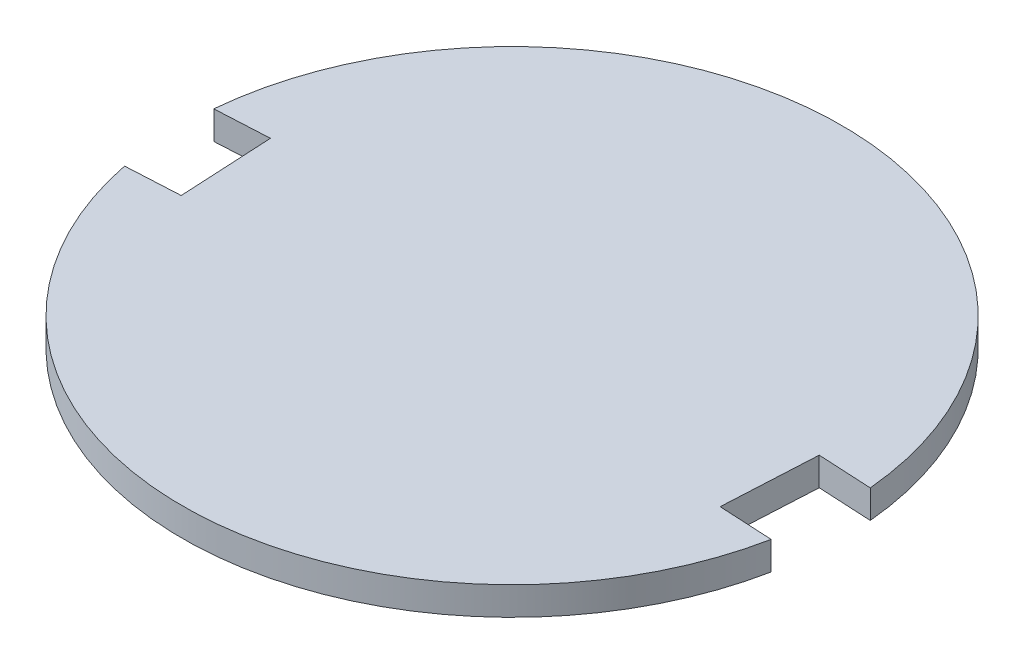
ISO-10303-21;
HEADER;
FILE_DESCRIPTION(('STEP AP214'),'2;1');
FILE_NAME('part.step','',(''),(''),'','','');
FILE_SCHEMA(('AUTOMOTIVE_DESIGN { 1 0 10303 214 1 1 1 1 }'));
ENDSEC;
DATA;
#1=APPLICATION_CONTEXT('core data for automotive mechanical design processes');
#2=APPLICATION_PROTOCOL_DEFINITION('international standard','automotive_design',2000,#1);
#3=PRODUCT_CONTEXT('',#1,'mechanical');
#4=PRODUCT('Part','Part','',(#3));
#5=PRODUCT_RELATED_PRODUCT_CATEGORY('part','',(#4));
#6=PRODUCT_DEFINITION_FORMATION('','',#4);
#7=PRODUCT_DEFINITION_CONTEXT('part definition',#1,'design');
#8=PRODUCT_DEFINITION('design','',#6,#7);
#9=PRODUCT_DEFINITION_SHAPE('','',#8);
#10=(LENGTH_UNIT() NAMED_UNIT(*) SI_UNIT(.MILLI.,.METRE.));
#11=(NAMED_UNIT(*) PLANE_ANGLE_UNIT() SI_UNIT($,.RADIAN.));
#12=(NAMED_UNIT(*) SI_UNIT($,.STERADIAN.) SOLID_ANGLE_UNIT());
#13=UNCERTAINTY_MEASURE_WITH_UNIT(LENGTH_MEASURE(1.E-05),#10,'distance_accuracy_value','');
#14=(GEOMETRIC_REPRESENTATION_CONTEXT(3) GLOBAL_UNCERTAINTY_ASSIGNED_CONTEXT((#13)) GLOBAL_UNIT_ASSIGNED_CONTEXT((#10,
#11,#12)) REPRESENTATION_CONTEXT('',''));
#15=CARTESIAN_POINT('',(0.,0.,0.));
#16=DIRECTION('',(0.,0.,1.));
#17=DIRECTION('',(1.,0.,0.));
#18=AXIS2_PLACEMENT_3D('',#15,#16,#17);
#19=CARTESIAN_POINT('',(2.27013722600386,3.,-17.1395360563293));
#20=DIRECTION('',(0.,-1.,0.));
#21=DIRECTION('',(0.,0.,-1.));
#22=AXIS2_PLACEMENT_3D('',#19,#20,#21);
#23=CYLINDRICAL_SURFACE('',#22,35.);
#24=CARTESIAN_POINT('',(2.27013722600386,0.,-17.1395360563293));
#25=DIRECTION('',(0.,1.,0.));
#26=DIRECTION('',(0.,0.,1.));
#27=AXIS2_PLACEMENT_3D('',#24,#25,#26);
#28=CIRCLE('',#27,35.);
#29=CARTESIAN_POINT('',(-32.0590257375146,0.,-10.3198168374615));
#30=VERTEX_POINT('',#29);
#31=CARTESIAN_POINT('',(36.5993001895223,0.,-10.3198168374615));
#32=VERTEX_POINT('',#31);
#33=EDGE_CURVE('E137',#30,#32,#28,.T.);
#34=ORIENTED_EDGE('',*,*,#33,.T.);
#35=DIRECTION('',(0.,-1.,0.));
#36=VECTOR('',#35,1.);
#37=CARTESIAN_POINT('',(36.5993001895223,3.,-10.3198168374615));
#38=LINE('',#37,#36);
#39=CARTESIAN_POINT('',(36.5993001895223,3.,-10.3198168374615));
#40=VERTEX_POINT('',#39);
#41=EDGE_CURVE('E11',#40,#32,#38,.T.);
#42=ORIENTED_EDGE('',*,*,#41,.F.);
#43=CARTESIAN_POINT('',(2.27013722600386,3.,-17.1395360563293));
#44=DIRECTION('',(0.,1.,0.));
#45=DIRECTION('',(0.,0.,1.));
#46=AXIS2_PLACEMENT_3D('',#43,#44,#45);
#47=CIRCLE('',#46,35.);
#48=CARTESIAN_POINT('',(-32.0590257375146,3.,-10.3198168374615));
#49=VERTEX_POINT('',#48);
#50=EDGE_CURVE('E151',#49,#40,#47,.T.);
#51=ORIENTED_EDGE('',*,*,#50,.F.);
#52=DIRECTION('',(0.,-1.,0.));
#53=VECTOR('',#52,1.);
#54=CARTESIAN_POINT('',(-32.0590257375146,3.,-10.3198168374615));
#55=LINE('',#54,#53);
#56=EDGE_CURVE('E133',#49,#30,#55,.T.);
#57=ORIENTED_EDGE('',*,*,#56,.T.);
#58=EDGE_LOOP('',(#34,#42,#51,#57));
#59=FACE_BOUND('',#58,.T.);
#60=ADVANCED_FACE('F41',(#59),#23,.T.);
#61=CARTESIAN_POINT('',(36.5993001895223,3.,-10.3198168374615));
#62=DIRECTION('',(-0.0523359562429439,0.,0.998629534754574));
#63=DIRECTION('',(0.998629534754574,0.,0.0523359562429439));
#64=AXIS2_PLACEMENT_3D('',#61,#62,#63);
#65=PLANE('',#64);
#66=DIRECTION('',(-0.998629534754574,0.,-0.0523359562429439));
#67=VECTOR('',#66,1.);
#68=CARTESIAN_POINT('',(36.5993001895223,0.,-10.3198168374615));
#69=LINE('',#68,#67);
#70=CARTESIAN_POINT('',(30.8848177542112,0.,-10.6193001716481));
#71=VERTEX_POINT('',#70);
#72=EDGE_CURVE('E140',#32,#71,#69,.T.);
#73=ORIENTED_EDGE('',*,*,#72,.T.);
#74=DIRECTION('',(0.,-1.,0.));
#75=VECTOR('',#74,1.);
#76=CARTESIAN_POINT('',(30.8848177542112,3.,-10.6193001716481));
#77=LINE('',#76,#75);
#78=CARTESIAN_POINT('',(30.8848177542112,3.,-10.6193001716481));
#79=VERTEX_POINT('',#78);
#80=EDGE_CURVE('E49',#79,#71,#77,.T.);
#81=ORIENTED_EDGE('',*,*,#80,.F.);
#82=DIRECTION('',(-0.998629534754574,0.,-0.0523359562429439));
#83=VECTOR('',#82,1.);
#84=CARTESIAN_POINT('',(36.5993001895223,3.,-10.3198168374615));
#85=LINE('',#84,#83);
#86=EDGE_CURVE('E100',#40,#79,#85,.T.);
#87=ORIENTED_EDGE('',*,*,#86,.F.);
#88=ORIENTED_EDGE('',*,*,#41,.T.);
#89=EDGE_LOOP('',(#73,#81,#87,#88));
#90=FACE_BOUND('',#89,.T.);
#91=ADVANCED_FACE('F186',(#90),#65,.F.);
#92=CARTESIAN_POINT('',(30.8848177542112,3.,-10.6193001716481));
#93=DIRECTION('',(-0.998629534754574,0.,-0.052335956242944));
#94=DIRECTION('',(-0.052335956242944,0.,0.998629534754574));
#95=AXIS2_PLACEMENT_3D('',#92,#93,#94);
#96=PLANE('',#95);
#97=DIRECTION('',(0.052335956242944,0.,-0.998629534754574));
#98=VECTOR('',#97,1.);
#99=CARTESIAN_POINT('',(30.8848177542112,0.,-10.6193001716481));
#100=LINE('',#99,#98);
#101=CARTESIAN_POINT('',(31.4088955470416,0.,-20.6193001716481));
#102=VERTEX_POINT('',#101);
#103=EDGE_CURVE('E142',#71,#102,#100,.T.);
#104=ORIENTED_EDGE('',*,*,#103,.T.);
#105=DIRECTION('',(0.,-1.,0.));
#106=VECTOR('',#105,1.);
#107=CARTESIAN_POINT('',(31.4088955470416,3.,-20.6193001716481));
#108=LINE('',#107,#106);
#109=CARTESIAN_POINT('',(31.4088955470416,3.,-20.6193001716481));
#110=VERTEX_POINT('',#109);
#111=EDGE_CURVE('E158',#110,#102,#108,.T.);
#112=ORIENTED_EDGE('',*,*,#111,.F.);
#113=DIRECTION('',(0.052335956242944,0.,-0.998629534754574));
#114=VECTOR('',#113,1.);
#115=CARTESIAN_POINT('',(30.8848177542112,3.,-10.6193001716481));
#116=LINE('',#115,#114);
#117=EDGE_CURVE('E166',#79,#110,#116,.T.);
#118=ORIENTED_EDGE('',*,*,#117,.F.);
#119=ORIENTED_EDGE('',*,*,#80,.T.);
#120=EDGE_LOOP('',(#104,#112,#118,#119));
#121=FACE_BOUND('',#120,.T.);
#122=ADVANCED_FACE('F164',(#121),#96,.F.);
#123=CARTESIAN_POINT('',(31.4088955470416,3.,-20.6193001716481));
#124=DIRECTION('',(0.0523359562429448,0.,-0.998629534754574));
#125=DIRECTION('',(-0.998629534754574,0.,-0.0523359562429448));
#126=AXIS2_PLACEMENT_3D('',#123,#124,#125);
#127=PLANE('',#126);
#128=DIRECTION('',(0.998629534754574,0.,0.0523359562429448));
#129=VECTOR('',#128,1.);
#130=CARTESIAN_POINT('',(31.4088955470416,0.,-20.6193001716481));
#131=LINE('',#130,#129);
#132=CARTESIAN_POINT('',(37.1253588498944,0.,-20.3197130245926));
#133=VERTEX_POINT('',#132);
#134=EDGE_CURVE('E144',#102,#133,#131,.T.);
#135=ORIENTED_EDGE('',*,*,#134,.T.);
#136=DIRECTION('',(0.,-1.,0.));
#137=VECTOR('',#136,1.);
#138=CARTESIAN_POINT('',(37.1253588498944,3.,-20.3197130245926));
#139=LINE('',#138,#137);
#140=CARTESIAN_POINT('',(37.1253588498944,3.,-20.3197130245926));
#141=VERTEX_POINT('',#140);
#142=EDGE_CURVE('E155',#141,#133,#139,.T.);
#143=ORIENTED_EDGE('',*,*,#142,.F.);
#144=DIRECTION('',(0.998629534754574,0.,0.0523359562429448));
#145=VECTOR('',#144,1.);
#146=CARTESIAN_POINT('',(31.4088955470416,3.,-20.6193001716481));
#147=LINE('',#146,#145);
#148=EDGE_CURVE('E178',#110,#141,#147,.T.);
#149=ORIENTED_EDGE('',*,*,#148,.F.);
#150=ORIENTED_EDGE('',*,*,#111,.T.);
#151=EDGE_LOOP('',(#135,#143,#149,#150));
#152=FACE_BOUND('',#151,.T.);
#153=ADVANCED_FACE('F174',(#152),#127,.F.);
#154=CARTESIAN_POINT('',(2.27013722600386,3.,-17.1395360563293));
#155=DIRECTION('',(0.,-1.,0.));
#156=DIRECTION('',(0.,0.,-1.));
#157=AXIS2_PLACEMENT_3D('',#154,#155,#156);
#158=CYLINDRICAL_SURFACE('',#157,35.);
#159=CARTESIAN_POINT('',(2.27013722600386,0.,-17.1395360563293));
#160=DIRECTION('',(0.,1.,0.));
#161=DIRECTION('',(0.,0.,1.));
#162=AXIS2_PLACEMENT_3D('',#159,#160,#161);
#163=CIRCLE('',#162,35.);
#164=CARTESIAN_POINT('',(-32.5850843978867,0.,-20.3197130245926));
#165=VERTEX_POINT('',#164);
#166=EDGE_CURVE('E146',#133,#165,#163,.T.);
#167=ORIENTED_EDGE('',*,*,#166,.T.);
#168=DIRECTION('',(0.,-1.,0.));
#169=VECTOR('',#168,1.);
#170=CARTESIAN_POINT('',(-32.5850843978867,3.,-20.3197130245926));
#171=LINE('',#170,#169);
#172=CARTESIAN_POINT('',(-32.5850843978867,3.,-20.3197130245926));
#173=VERTEX_POINT('',#172);
#174=EDGE_CURVE('E128',#173,#165,#171,.T.);
#175=ORIENTED_EDGE('',*,*,#174,.F.);
#176=CARTESIAN_POINT('',(2.27013722600386,3.,-17.1395360563293));
#177=DIRECTION('',(0.,1.,0.));
#178=DIRECTION('',(0.,0.,1.));
#179=AXIS2_PLACEMENT_3D('',#176,#177,#178);
#180=CIRCLE('',#179,35.);
#181=EDGE_CURVE('E119',#141,#173,#180,.T.);
#182=ORIENTED_EDGE('',*,*,#181,.F.);
#183=ORIENTED_EDGE('',*,*,#142,.T.);
#184=EDGE_LOOP('',(#167,#175,#182,#183));
#185=FACE_BOUND('',#184,.T.);
#186=ADVANCED_FACE('F177',(#185),#158,.T.);
#187=CARTESIAN_POINT('',(-26.8686210950339,3.,-20.6193001716481));
#188=DIRECTION('',(-0.0523359562429448,0.,-0.998629534754574));
#189=DIRECTION('',(-0.998629534754574,0.,0.0523359562429448));
#190=AXIS2_PLACEMENT_3D('',#187,#188,#189);
#191=PLANE('',#190);
#192=DIRECTION('',(0.998629534754574,0.,-0.0523359562429448));
#193=VECTOR('',#192,1.);
#194=CARTESIAN_POINT('',(-26.8686210950339,0.,-20.6193001716481));
#195=LINE('',#194,#193);
#196=CARTESIAN_POINT('',(-26.8686210950339,0.,-20.6193001716481));
#197=VERTEX_POINT('',#196);
#198=EDGE_CURVE('E127',#165,#197,#195,.T.);
#199=ORIENTED_EDGE('',*,*,#198,.T.);
#200=DIRECTION('',(0.,-1.,0.));
#201=VECTOR('',#200,1.);
#202=CARTESIAN_POINT('',(-26.8686210950339,3.,-20.6193001716481));
#203=LINE('',#202,#201);
#204=CARTESIAN_POINT('',(-26.8686210950339,3.,-20.6193001716481));
#205=VERTEX_POINT('',#204);
#206=EDGE_CURVE('E124',#205,#197,#203,.T.);
#207=ORIENTED_EDGE('',*,*,#206,.F.);
#208=DIRECTION('',(0.998629534754574,0.,-0.0523359562429448));
#209=VECTOR('',#208,1.);
#210=CARTESIAN_POINT('',(-26.8686210950339,3.,-20.6193001716481));
#211=LINE('',#210,#209);
#212=EDGE_CURVE('E113',#173,#205,#211,.T.);
#213=ORIENTED_EDGE('',*,*,#212,.F.);
#214=ORIENTED_EDGE('',*,*,#174,.T.);
#215=EDGE_LOOP('',(#199,#207,#213,#214));
#216=FACE_BOUND('',#215,.T.);
#217=ADVANCED_FACE('F125',(#216),#191,.F.);
#218=CARTESIAN_POINT('',(-26.3445433022035,3.,-10.6193001716481));
#219=DIRECTION('',(0.998629534754574,0.,-0.052335956242944));
#220=DIRECTION('',(-0.052335956242944,0.,-0.998629534754574));
#221=AXIS2_PLACEMENT_3D('',#218,#219,#220);
#222=PLANE('',#221);
#223=DIRECTION('',(0.052335956242944,0.,0.998629534754574));
#224=VECTOR('',#223,1.);
#225=CARTESIAN_POINT('',(-26.3445433022035,0.,-10.6193001716481));
#226=LINE('',#225,#224);
#227=CARTESIAN_POINT('',(-26.3445433022035,0.,-10.6193001716481));
#228=VERTEX_POINT('',#227);
#229=EDGE_CURVE('E86',#197,#228,#226,.T.);
#230=ORIENTED_EDGE('',*,*,#229,.T.);
#231=DIRECTION('',(0.,-1.,0.));
#232=VECTOR('',#231,1.);
#233=CARTESIAN_POINT('',(-26.3445433022035,3.,-10.6193001716481));
#234=LINE('',#233,#232);
#235=CARTESIAN_POINT('',(-26.3445433022035,3.,-10.6193001716481));
#236=VERTEX_POINT('',#235);
#237=EDGE_CURVE('E129',#236,#228,#234,.T.);
#238=ORIENTED_EDGE('',*,*,#237,.F.);
#239=DIRECTION('',(0.052335956242944,0.,0.998629534754574));
#240=VECTOR('',#239,1.);
#241=CARTESIAN_POINT('',(-26.3445433022035,3.,-10.6193001716481));
#242=LINE('',#241,#240);
#243=EDGE_CURVE('E117',#205,#236,#242,.T.);
#244=ORIENTED_EDGE('',*,*,#243,.F.);
#245=ORIENTED_EDGE('',*,*,#206,.T.);
#246=EDGE_LOOP('',(#230,#238,#244,#245));
#247=FACE_BOUND('',#246,.T.);
#248=ADVANCED_FACE('F131',(#247),#222,.F.);
#249=CARTESIAN_POINT('',(-32.0590257375146,3.,-10.3198168374615));
#250=DIRECTION('',(0.0523359562429439,0.,0.998629534754574));
#251=DIRECTION('',(0.998629534754574,0.,-0.0523359562429439));
#252=AXIS2_PLACEMENT_3D('',#249,#250,#251);
#253=PLANE('',#252);
#254=DIRECTION('',(-0.998629534754574,0.,0.0523359562429439));
#255=VECTOR('',#254,1.);
#256=CARTESIAN_POINT('',(-32.0590257375146,0.,-10.3198168374615));
#257=LINE('',#256,#255);
#258=EDGE_CURVE('E92',#228,#30,#257,.T.);
#259=ORIENTED_EDGE('',*,*,#258,.T.);
#260=ORIENTED_EDGE('',*,*,#56,.F.);
#261=DIRECTION('',(-0.998629534754574,0.,0.0523359562429439));
#262=VECTOR('',#261,1.);
#263=CARTESIAN_POINT('',(-32.0590257375146,3.,-10.3198168374615));
#264=LINE('',#263,#262);
#265=EDGE_CURVE('E57',#236,#49,#264,.T.);
#266=ORIENTED_EDGE('',*,*,#265,.F.);
#267=ORIENTED_EDGE('',*,*,#237,.T.);
#268=EDGE_LOOP('',(#259,#260,#266,#267));
#269=FACE_BOUND('',#268,.T.);
#270=ADVANCED_FACE('F202',(#269),#253,.F.);
#271=CARTESIAN_POINT('',(2.27013722600386,3.,-17.1395360563293));
#272=DIRECTION('',(0.,1.,0.));
#273=DIRECTION('',(0.,0.,1.));
#274=AXIS2_PLACEMENT_3D('',#271,#272,#273);
#275=PLANE('',#274);
#276=ORIENTED_EDGE('',*,*,#50,.T.);
#277=ORIENTED_EDGE('',*,*,#86,.T.);
#278=ORIENTED_EDGE('',*,*,#117,.T.);
#279=ORIENTED_EDGE('',*,*,#148,.T.);
#280=ORIENTED_EDGE('',*,*,#181,.T.);
#281=ORIENTED_EDGE('',*,*,#212,.T.);
#282=ORIENTED_EDGE('',*,*,#243,.T.);
#283=ORIENTED_EDGE('',*,*,#265,.T.);
#284=EDGE_LOOP('',(#276,#277,#278,#279,#280,#281,#282,#283));
#285=FACE_BOUND('',#284,.T.);
#286=ADVANCED_FACE('F115',(#285),#275,.T.);
#287=CARTESIAN_POINT('',(2.27013722600386,0.,-17.1395360563293));
#288=DIRECTION('',(0.,1.,0.));
#289=DIRECTION('',(0.,0.,1.));
#290=AXIS2_PLACEMENT_3D('',#287,#288,#289);
#291=PLANE('',#290);
#292=ORIENTED_EDGE('',*,*,#33,.F.);
#293=ORIENTED_EDGE('',*,*,#258,.F.);
#294=ORIENTED_EDGE('',*,*,#229,.F.);
#295=ORIENTED_EDGE('',*,*,#198,.F.);
#296=ORIENTED_EDGE('',*,*,#166,.F.);
#297=ORIENTED_EDGE('',*,*,#134,.F.);
#298=ORIENTED_EDGE('',*,*,#103,.F.);
#299=ORIENTED_EDGE('',*,*,#72,.F.);
#300=EDGE_LOOP('',(#292,#293,#294,#295,#296,#297,#298,#299));
#301=FACE_BOUND('',#300,.T.);
#302=ADVANCED_FACE('F170',(#301),#291,.F.);
#303=CLOSED_SHELL('',(#60,#91,#122,#153,#186,#217,#248,#270,#286,#302));
#304=MANIFOLD_SOLID_BREP('B2',#303);
#305=ADVANCED_BREP_SHAPE_REPRESENTATION('',(#18,#304),#14);
#306=SHAPE_DEFINITION_REPRESENTATION(#9,#305);
ENDSEC;
END-ISO-10303-21;
